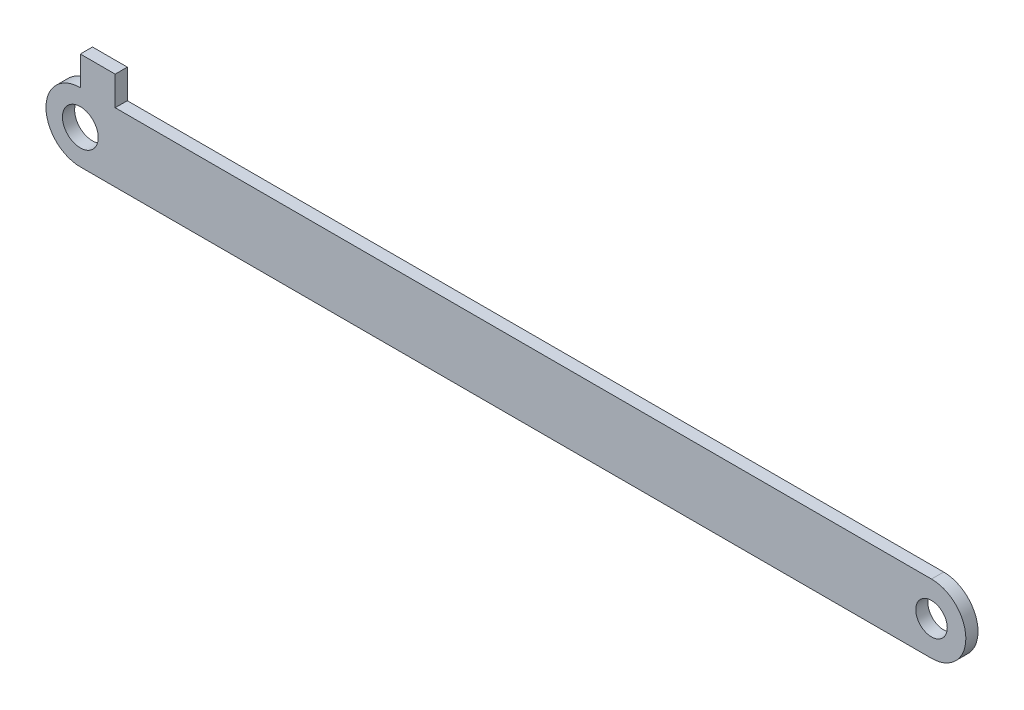
ISO-10303-21;
HEADER;
FILE_DESCRIPTION(('STEP AP214'),'2;1');
FILE_NAME('part.step','',(''),(''),'','','');
FILE_SCHEMA(('AUTOMOTIVE_DESIGN { 1 0 10303 214 1 1 1 1 }'));
ENDSEC;
DATA;
#1=APPLICATION_CONTEXT('core data for automotive mechanical design processes');
#2=APPLICATION_PROTOCOL_DEFINITION('international standard','automotive_design',2000,#1);
#3=PRODUCT_CONTEXT('',#1,'mechanical');
#4=PRODUCT('Part','Part','',(#3));
#5=PRODUCT_RELATED_PRODUCT_CATEGORY('part','',(#4));
#6=PRODUCT_DEFINITION_FORMATION('','',#4);
#7=PRODUCT_DEFINITION_CONTEXT('part definition',#1,'design');
#8=PRODUCT_DEFINITION('design','',#6,#7);
#9=PRODUCT_DEFINITION_SHAPE('','',#8);
#10=(LENGTH_UNIT() NAMED_UNIT(*) SI_UNIT(.MILLI.,.METRE.));
#11=(NAMED_UNIT(*) PLANE_ANGLE_UNIT() SI_UNIT($,.RADIAN.));
#12=(NAMED_UNIT(*) SI_UNIT($,.STERADIAN.) SOLID_ANGLE_UNIT());
#13=UNCERTAINTY_MEASURE_WITH_UNIT(LENGTH_MEASURE(1.E-05),#10,'distance_accuracy_value','');
#14=(GEOMETRIC_REPRESENTATION_CONTEXT(3) GLOBAL_UNCERTAINTY_ASSIGNED_CONTEXT((#13)) GLOBAL_UNIT_ASSIGNED_CONTEXT((#10,
#11,#12)) REPRESENTATION_CONTEXT('',''));
#15=CARTESIAN_POINT('',(0.,0.,0.));
#16=DIRECTION('',(0.,0.,1.));
#17=DIRECTION('',(1.,0.,0.));
#18=AXIS2_PLACEMENT_3D('',#15,#16,#17);
#19=CARTESIAN_POINT('',(0.,14.1203703703704,5.));
#20=DIRECTION('',(0.,-1.,0.));
#21=DIRECTION('',(0.,0.,-1.));
#22=AXIS2_PLACEMENT_3D('',#19,#20,#21);
#23=PLANE('',#22);
#24=DIRECTION('',(0.,0.,-1.));
#25=VECTOR('',#24,1.);
#26=CARTESIAN_POINT('',(14.3239771734986,14.1203703703704,5.));
#27=LINE('',#26,#25);
#28=CARTESIAN_POINT('',(14.3239771734986,14.1203703703704,5.));
#29=VERTEX_POINT('',#28);
#30=CARTESIAN_POINT('',(14.3239771734986,14.1203703703704,0.));
#31=VERTEX_POINT('',#30);
#32=EDGE_CURVE('E48',#29,#31,#27,.T.);
#33=ORIENTED_EDGE('',*,*,#32,.F.);
#34=DIRECTION('',(-1.,0.,0.));
#35=VECTOR('',#34,1.);
#36=CARTESIAN_POINT('',(0.,14.1203703703704,5.));
#37=LINE('',#36,#35);
#38=CARTESIAN_POINT('',(350.,14.1203703703704,5.));
#39=VERTEX_POINT('',#38);
#40=EDGE_CURVE('E101',#39,#29,#37,.T.);
#41=ORIENTED_EDGE('',*,*,#40,.F.);
#42=DIRECTION('',(0.,0.,-1.));
#43=VECTOR('',#42,1.);
#44=CARTESIAN_POINT('',(350.,14.1203703703704,5.));
#45=LINE('',#44,#43);
#46=CARTESIAN_POINT('',(350.,14.1203703703704,0.));
#47=VERTEX_POINT('',#46);
#48=EDGE_CURVE('E157',#39,#47,#45,.T.);
#49=ORIENTED_EDGE('',*,*,#48,.T.);
#50=DIRECTION('',(-1.,0.,0.));
#51=VECTOR('',#50,1.);
#52=CARTESIAN_POINT('',(0.,14.1203703703704,0.));
#53=LINE('',#52,#51);
#54=EDGE_CURVE('E53',#47,#31,#53,.T.);
#55=ORIENTED_EDGE('',*,*,#54,.T.);
#56=EDGE_LOOP('',(#33,#41,#49,#55));
#57=FACE_BOUND('',#56,.T.);
#58=ADVANCED_FACE('F33',(#57),#23,.F.);
#59=CARTESIAN_POINT('',(0.,0.,5.));
#60=DIRECTION('',(0.,0.,1.));
#61=DIRECTION('',(1.,0.,0.));
#62=AXIS2_PLACEMENT_3D('',#59,#60,#61);
#63=PLANE('',#62);
#64=CARTESIAN_POINT('',(0.,0.,5.));
#65=DIRECTION('',(0.,0.,1.));
#66=DIRECTION('',(1.,0.,0.));
#67=AXIS2_PLACEMENT_3D('',#64,#65,#66);
#68=CIRCLE('',#67,7.35295378438355);
#69=CARTESIAN_POINT('',(7.35295378438355,0.,5.));
#70=VERTEX_POINT('',#69);
#71=EDGE_CURVE('E134',#70,#70,#68,.T.);
#72=ORIENTED_EDGE('',*,*,#71,.F.);
#73=EDGE_LOOP('',(#72));
#74=FACE_BOUND('',#73,.T.);
#75=CARTESIAN_POINT('',(0.,0.,5.));
#76=DIRECTION('',(0.,0.,1.));
#77=DIRECTION('',(1.,0.,0.));
#78=AXIS2_PLACEMENT_3D('',#75,#76,#77);
#79=CIRCLE('',#78,14.1203703703704);
#80=CARTESIAN_POINT('',(0.,14.1203703703704,5.));
#81=VERTEX_POINT('',#80);
#82=CARTESIAN_POINT('',(0.,-14.1203703703704,5.));
#83=VERTEX_POINT('',#82);
#84=EDGE_CURVE('E140',#81,#83,#79,.T.);
#85=ORIENTED_EDGE('',*,*,#84,.T.);
#86=DIRECTION('',(1.,0.,0.));
#87=VECTOR('',#86,1.);
#88=CARTESIAN_POINT('',(0.,-14.1203703703704,5.));
#89=LINE('',#88,#87);
#90=CARTESIAN_POINT('',(350.,-14.1203703703704,5.));
#91=VERTEX_POINT('',#90);
#92=EDGE_CURVE('E142',#83,#91,#89,.T.);
#93=ORIENTED_EDGE('',*,*,#92,.T.);
#94=CARTESIAN_POINT('',(350.,0.,5.));
#95=DIRECTION('',(0.,0.,1.));
#96=DIRECTION('',(1.,0.,0.));
#97=AXIS2_PLACEMENT_3D('',#94,#95,#96);
#98=CIRCLE('',#97,14.1203703703704);
#99=EDGE_CURVE('E144',#91,#39,#98,.T.);
#100=ORIENTED_EDGE('',*,*,#99,.T.);
#101=ORIENTED_EDGE('',*,*,#40,.T.);
#102=DIRECTION('',(0.,1.,0.));
#103=VECTOR('',#102,1.);
#104=CARTESIAN_POINT('',(14.3239771734986,26.0937861070238,5.));
#105=LINE('',#104,#103);
#106=CARTESIAN_POINT('',(14.3239771734986,26.0937861070238,5.));
#107=VERTEX_POINT('',#106);
#108=EDGE_CURVE('E92',#29,#107,#105,.T.);
#109=ORIENTED_EDGE('',*,*,#108,.T.);
#110=DIRECTION('',(-1.,0.,0.));
#111=VECTOR('',#110,1.);
#112=CARTESIAN_POINT('',(0.,26.0937861070238,5.));
#113=LINE('',#112,#111);
#114=CARTESIAN_POINT('',(0.,26.0937861070238,5.));
#115=VERTEX_POINT('',#114);
#116=EDGE_CURVE('E99',#107,#115,#113,.T.);
#117=ORIENTED_EDGE('',*,*,#116,.T.);
#118=DIRECTION('',(0.,-1.,0.));
#119=VECTOR('',#118,1.);
#120=CARTESIAN_POINT('',(0.,14.1203703703704,5.));
#121=LINE('',#120,#119);
#122=EDGE_CURVE('E116',#115,#81,#121,.T.);
#123=ORIENTED_EDGE('',*,*,#122,.T.);
#124=EDGE_LOOP('',(#85,#93,#100,#101,#109,#117,#123));
#125=FACE_BOUND('',#124,.T.);
#126=CARTESIAN_POINT('',(350.,0.,5.));
#127=DIRECTION('',(0.,0.,1.));
#128=DIRECTION('',(1.,0.,0.));
#129=AXIS2_PLACEMENT_3D('',#126,#127,#128);
#130=CIRCLE('',#129,6.48561376209349);
#131=CARTESIAN_POINT('',(356.485613762093,0.,5.));
#132=VERTEX_POINT('',#131);
#133=EDGE_CURVE('E128',#132,#132,#130,.T.);
#134=ORIENTED_EDGE('',*,*,#133,.F.);
#135=EDGE_LOOP('',(#134));
#136=FACE_BOUND('',#135,.T.);
#137=ADVANCED_FACE('F95',(#74,#125,#136),#63,.T.);
#138=CARTESIAN_POINT('',(0.,0.,0.));
#139=DIRECTION('',(0.,0.,1.));
#140=DIRECTION('',(1.,0.,0.));
#141=AXIS2_PLACEMENT_3D('',#138,#139,#140);
#142=PLANE('',#141);
#143=CARTESIAN_POINT('',(0.,0.,0.));
#144=DIRECTION('',(0.,0.,1.));
#145=DIRECTION('',(1.,0.,0.));
#146=AXIS2_PLACEMENT_3D('',#143,#144,#145);
#147=CIRCLE('',#146,14.1203703703704);
#148=CARTESIAN_POINT('',(0.,14.1203703703704,0.));
#149=VERTEX_POINT('',#148);
#150=CARTESIAN_POINT('',(0.,-14.1203703703704,0.));
#151=VERTEX_POINT('',#150);
#152=EDGE_CURVE('E137',#149,#151,#147,.T.);
#153=ORIENTED_EDGE('',*,*,#152,.F.);
#154=DIRECTION('',(0.,-1.,0.));
#155=VECTOR('',#154,1.);
#156=CARTESIAN_POINT('',(0.,14.1203703703704,0.));
#157=LINE('',#156,#155);
#158=CARTESIAN_POINT('',(0.,26.0937861070238,0.));
#159=VERTEX_POINT('',#158);
#160=EDGE_CURVE('E103',#159,#149,#157,.T.);
#161=ORIENTED_EDGE('',*,*,#160,.F.);
#162=DIRECTION('',(-1.,0.,0.));
#163=VECTOR('',#162,1.);
#164=CARTESIAN_POINT('',(0.,26.0937861070238,0.));
#165=LINE('',#164,#163);
#166=CARTESIAN_POINT('',(14.3239771734986,26.0937861070238,0.));
#167=VERTEX_POINT('',#166);
#168=EDGE_CURVE('E121',#167,#159,#165,.T.);
#169=ORIENTED_EDGE('',*,*,#168,.F.);
#170=DIRECTION('',(0.,1.,0.));
#171=VECTOR('',#170,1.);
#172=CARTESIAN_POINT('',(14.3239771734986,26.0937861070238,0.));
#173=LINE('',#172,#171);
#174=EDGE_CURVE('E108',#31,#167,#173,.T.);
#175=ORIENTED_EDGE('',*,*,#174,.F.);
#176=ORIENTED_EDGE('',*,*,#54,.F.);
#177=CARTESIAN_POINT('',(350.,0.,0.));
#178=DIRECTION('',(0.,0.,1.));
#179=DIRECTION('',(1.,0.,0.));
#180=AXIS2_PLACEMENT_3D('',#177,#178,#179);
#181=CIRCLE('',#180,14.1203703703704);
#182=CARTESIAN_POINT('',(350.,-14.1203703703704,0.));
#183=VERTEX_POINT('',#182);
#184=EDGE_CURVE('E152',#183,#47,#181,.T.);
#185=ORIENTED_EDGE('',*,*,#184,.F.);
#186=DIRECTION('',(1.,0.,0.));
#187=VECTOR('',#186,1.);
#188=CARTESIAN_POINT('',(0.,-14.1203703703704,0.));
#189=LINE('',#188,#187);
#190=EDGE_CURVE('E150',#151,#183,#189,.T.);
#191=ORIENTED_EDGE('',*,*,#190,.F.);
#192=EDGE_LOOP('',(#153,#161,#169,#175,#176,#185,#191));
#193=FACE_BOUND('',#192,.T.);
#194=CARTESIAN_POINT('',(0.,0.,0.));
#195=DIRECTION('',(0.,0.,1.));
#196=DIRECTION('',(1.,0.,0.));
#197=AXIS2_PLACEMENT_3D('',#194,#195,#196);
#198=CIRCLE('',#197,7.35295378438355);
#199=CARTESIAN_POINT('',(7.35295378438355,0.,0.));
#200=VERTEX_POINT('',#199);
#201=EDGE_CURVE('E131',#200,#200,#198,.T.);
#202=ORIENTED_EDGE('',*,*,#201,.T.);
#203=EDGE_LOOP('',(#202));
#204=FACE_BOUND('',#203,.T.);
#205=CARTESIAN_POINT('',(350.,0.,0.));
#206=DIRECTION('',(0.,0.,1.));
#207=DIRECTION('',(1.,0.,0.));
#208=AXIS2_PLACEMENT_3D('',#205,#206,#207);
#209=CIRCLE('',#208,6.48561376209349);
#210=CARTESIAN_POINT('',(356.485613762093,0.,0.));
#211=VERTEX_POINT('',#210);
#212=EDGE_CURVE('E127',#211,#211,#209,.T.);
#213=ORIENTED_EDGE('',*,*,#212,.T.);
#214=EDGE_LOOP('',(#213));
#215=FACE_BOUND('',#214,.T.);
#216=ADVANCED_FACE('F167',(#193,#204,#215),#142,.F.);
#217=CARTESIAN_POINT('',(0.,0.,5.));
#218=DIRECTION('',(0.,0.,-1.));
#219=DIRECTION('',(-1.,0.,0.));
#220=AXIS2_PLACEMENT_3D('',#217,#218,#219);
#221=CYLINDRICAL_SURFACE('',#220,14.1203703703704);
#222=ORIENTED_EDGE('',*,*,#152,.T.);
#223=DIRECTION('',(0.,0.,-1.));
#224=VECTOR('',#223,1.);
#225=CARTESIAN_POINT('',(0.,-14.1203703703704,5.));
#226=LINE('',#225,#224);
#227=EDGE_CURVE('E11',#83,#151,#226,.T.);
#228=ORIENTED_EDGE('',*,*,#227,.F.);
#229=ORIENTED_EDGE('',*,*,#84,.F.);
#230=DIRECTION('',(0.,0.,-1.));
#231=VECTOR('',#230,1.);
#232=CARTESIAN_POINT('',(0.,14.1203703703704,5.));
#233=LINE('',#232,#231);
#234=EDGE_CURVE('E147',#81,#149,#233,.T.);
#235=ORIENTED_EDGE('',*,*,#234,.T.);
#236=EDGE_LOOP('',(#222,#228,#229,#235));
#237=FACE_BOUND('',#236,.T.);
#238=ADVANCED_FACE('F35',(#237),#221,.T.);
#239=CARTESIAN_POINT('',(0.,-14.1203703703704,5.));
#240=DIRECTION('',(0.,1.,0.));
#241=DIRECTION('',(0.,0.,1.));
#242=AXIS2_PLACEMENT_3D('',#239,#240,#241);
#243=PLANE('',#242);
#244=ORIENTED_EDGE('',*,*,#190,.T.);
#245=DIRECTION('',(0.,0.,-1.));
#246=VECTOR('',#245,1.);
#247=CARTESIAN_POINT('',(350.,-14.1203703703704,5.));
#248=LINE('',#247,#246);
#249=EDGE_CURVE('E41',#91,#183,#248,.T.);
#250=ORIENTED_EDGE('',*,*,#249,.F.);
#251=ORIENTED_EDGE('',*,*,#92,.F.);
#252=ORIENTED_EDGE('',*,*,#227,.T.);
#253=EDGE_LOOP('',(#244,#250,#251,#252));
#254=FACE_BOUND('',#253,.T.);
#255=ADVANCED_FACE('F175',(#254),#243,.F.);
#256=CARTESIAN_POINT('',(350.,0.,5.));
#257=DIRECTION('',(0.,0.,-1.));
#258=DIRECTION('',(-1.,0.,0.));
#259=AXIS2_PLACEMENT_3D('',#256,#257,#258);
#260=CYLINDRICAL_SURFACE('',#259,14.1203703703704);
#261=ORIENTED_EDGE('',*,*,#184,.T.);
#262=ORIENTED_EDGE('',*,*,#48,.F.);
#263=ORIENTED_EDGE('',*,*,#99,.F.);
#264=ORIENTED_EDGE('',*,*,#249,.T.);
#265=EDGE_LOOP('',(#261,#262,#263,#264));
#266=FACE_BOUND('',#265,.T.);
#267=ADVANCED_FACE('F163',(#266),#260,.T.);
#268=CARTESIAN_POINT('',(0.,0.,5.));
#269=DIRECTION('',(0.,0.,-1.));
#270=DIRECTION('',(-1.,0.,0.));
#271=AXIS2_PLACEMENT_3D('',#268,#269,#270);
#272=CYLINDRICAL_SURFACE('',#271,7.35295378438355);
#273=ORIENTED_EDGE('',*,*,#71,.T.);
#274=EDGE_LOOP('',(#273));
#275=FACE_BOUND('',#274,.T.);
#276=ORIENTED_EDGE('',*,*,#201,.F.);
#277=EDGE_LOOP('',(#276));
#278=FACE_BOUND('',#277,.T.);
#279=ADVANCED_FACE('F181',(#275,#278),#272,.F.);
#280=CARTESIAN_POINT('',(350.,0.,5.));
#281=DIRECTION('',(0.,0.,-1.));
#282=DIRECTION('',(-1.,0.,0.));
#283=AXIS2_PLACEMENT_3D('',#280,#281,#282);
#284=CYLINDRICAL_SURFACE('',#283,6.48561376209349);
#285=ORIENTED_EDGE('',*,*,#133,.T.);
#286=EDGE_LOOP('',(#285));
#287=FACE_BOUND('',#286,.T.);
#288=ORIENTED_EDGE('',*,*,#212,.F.);
#289=EDGE_LOOP('',(#288));
#290=FACE_BOUND('',#289,.T.);
#291=ADVANCED_FACE('F198',(#287,#290),#284,.F.);
#292=CARTESIAN_POINT('',(14.3239771734986,26.0937861070238,5.));
#293=DIRECTION('',(-1.,0.,0.));
#294=DIRECTION('',(0.,-1.,0.));
#295=AXIS2_PLACEMENT_3D('',#292,#293,#294);
#296=PLANE('',#295);
#297=ORIENTED_EDGE('',*,*,#174,.T.);
#298=DIRECTION('',(0.,0.,-1.));
#299=VECTOR('',#298,1.);
#300=CARTESIAN_POINT('',(14.3239771734986,26.0937861070238,5.));
#301=LINE('',#300,#299);
#302=EDGE_CURVE('E106',#107,#167,#301,.T.);
#303=ORIENTED_EDGE('',*,*,#302,.F.);
#304=ORIENTED_EDGE('',*,*,#108,.F.);
#305=ORIENTED_EDGE('',*,*,#32,.T.);
#306=EDGE_LOOP('',(#297,#303,#304,#305));
#307=FACE_BOUND('',#306,.T.);
#308=ADVANCED_FACE('F107',(#307),#296,.F.);
#309=CARTESIAN_POINT('',(0.,26.0937861070238,5.));
#310=DIRECTION('',(0.,-1.,0.));
#311=DIRECTION('',(0.,0.,-1.));
#312=AXIS2_PLACEMENT_3D('',#309,#310,#311);
#313=PLANE('',#312);
#314=ORIENTED_EDGE('',*,*,#168,.T.);
#315=DIRECTION('',(0.,0.,-1.));
#316=VECTOR('',#315,1.);
#317=CARTESIAN_POINT('',(0.,26.0937861070238,5.));
#318=LINE('',#317,#316);
#319=EDGE_CURVE('E111',#115,#159,#318,.T.);
#320=ORIENTED_EDGE('',*,*,#319,.F.);
#321=ORIENTED_EDGE('',*,*,#116,.F.);
#322=ORIENTED_EDGE('',*,*,#302,.T.);
#323=EDGE_LOOP('',(#314,#320,#321,#322));
#324=FACE_BOUND('',#323,.T.);
#325=ADVANCED_FACE('F113',(#324),#313,.F.);
#326=CARTESIAN_POINT('',(0.,14.1203703703704,5.));
#327=DIRECTION('',(1.,0.,0.));
#328=DIRECTION('',(0.,0.,-1.));
#329=AXIS2_PLACEMENT_3D('',#326,#327,#328);
#330=PLANE('',#329);
#331=ORIENTED_EDGE('',*,*,#160,.T.);
#332=ORIENTED_EDGE('',*,*,#234,.F.);
#333=ORIENTED_EDGE('',*,*,#122,.F.);
#334=ORIENTED_EDGE('',*,*,#319,.T.);
#335=EDGE_LOOP('',(#331,#332,#333,#334));
#336=FACE_BOUND('',#335,.T.);
#337=ADVANCED_FACE('F171',(#336),#330,.F.);
#338=CLOSED_SHELL('',(#58,#137,#216,#238,#255,#267,#279,#291,#308,#325,#337));
#339=MANIFOLD_SOLID_BREP('B2',#338);
#340=ADVANCED_BREP_SHAPE_REPRESENTATION('',(#18,#339),#14);
#341=SHAPE_DEFINITION_REPRESENTATION(#9,#340);
ENDSEC;
END-ISO-10303-21;
